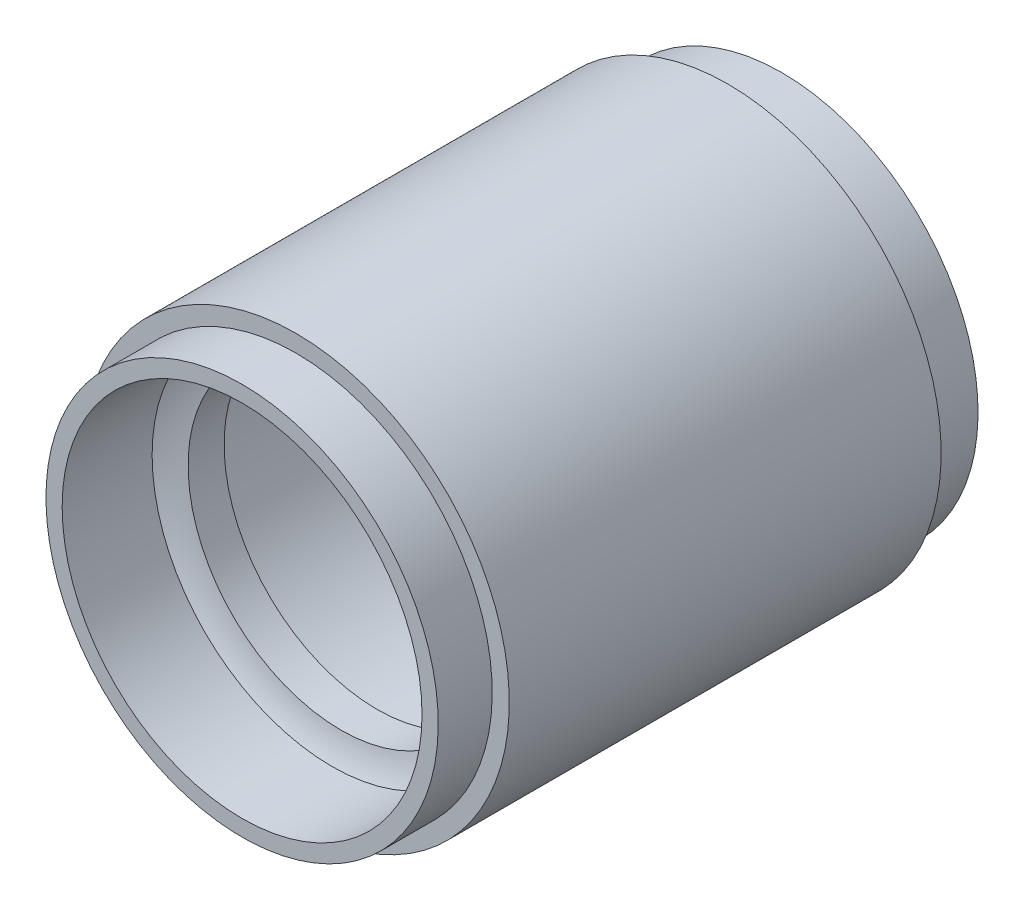
ISO-10303-21;
HEADER;
FILE_DESCRIPTION(('STEP AP214'),'2;1');
FILE_NAME('part.step','',(''),(''),'','','');
FILE_SCHEMA(('AUTOMOTIVE_DESIGN { 1 0 10303 214 1 1 1 1 }'));
ENDSEC;
DATA;
#1=APPLICATION_CONTEXT('core data for automotive mechanical design processes');
#2=APPLICATION_PROTOCOL_DEFINITION('international standard','automotive_design',2000,#1);
#3=PRODUCT_CONTEXT('',#1,'mechanical');
#4=PRODUCT('Part','Part','',(#3));
#5=PRODUCT_RELATED_PRODUCT_CATEGORY('part','',(#4));
#6=PRODUCT_DEFINITION_FORMATION('','',#4);
#7=PRODUCT_DEFINITION_CONTEXT('part definition',#1,'design');
#8=PRODUCT_DEFINITION('design','',#6,#7);
#9=PRODUCT_DEFINITION_SHAPE('','',#8);
#10=(LENGTH_UNIT() NAMED_UNIT(*) SI_UNIT(.MILLI.,.METRE.));
#11=(NAMED_UNIT(*) PLANE_ANGLE_UNIT() SI_UNIT($,.RADIAN.));
#12=(NAMED_UNIT(*) SI_UNIT($,.STERADIAN.) SOLID_ANGLE_UNIT());
#13=UNCERTAINTY_MEASURE_WITH_UNIT(LENGTH_MEASURE(1.E-05),#10,'distance_accuracy_value','');
#14=(GEOMETRIC_REPRESENTATION_CONTEXT(3) GLOBAL_UNCERTAINTY_ASSIGNED_CONTEXT((#13)) GLOBAL_UNIT_ASSIGNED_CONTEXT((#10,
#11,#12)) REPRESENTATION_CONTEXT('',''));
#15=CARTESIAN_POINT('',(0.,0.,0.));
#16=DIRECTION('',(0.,0.,1.));
#17=DIRECTION('',(1.,0.,0.));
#18=AXIS2_PLACEMENT_3D('',#15,#16,#17);
#19=CARTESIAN_POINT('',(0.,0.,0.));
#20=DIRECTION('',(0.,0.,-1.));
#21=DIRECTION('',(0.,1.,0.));
#22=AXIS2_PLACEMENT_3D('',#19,#20,#21);
#23=CYLINDRICAL_SURFACE('',#22,10.);
#24=CARTESIAN_POINT('',(0.,0.,10.));
#25=DIRECTION('',(0.,0.,-1.));
#26=DIRECTION('',(0.,1.,0.));
#27=AXIS2_PLACEMENT_3D('',#24,#25,#26);
#28=CIRCLE('',#27,10.);
#29=CARTESIAN_POINT('',(0.,10.,10.));
#30=VERTEX_POINT('',#29);
#31=EDGE_CURVE('E82',#30,#30,#28,.T.);
#32=ORIENTED_EDGE('',*,*,#31,.T.);
#33=EDGE_LOOP('',(#32));
#34=FACE_BOUND('',#33,.T.);
#35=CARTESIAN_POINT('',(0.,0.,15.));
#36=DIRECTION('',(0.,0.,-1.));
#37=DIRECTION('',(0.,1.,0.));
#38=AXIS2_PLACEMENT_3D('',#35,#36,#37);
#39=CIRCLE('',#38,10.);
#40=CARTESIAN_POINT('',(0.,10.,15.));
#41=VERTEX_POINT('',#40);
#42=EDGE_CURVE('E10',#41,#41,#39,.T.);
#43=ORIENTED_EDGE('',*,*,#42,.F.);
#44=EDGE_LOOP('',(#43));
#45=FACE_BOUND('',#44,.T.);
#46=ADVANCED_FACE('F30',(#34,#45),#23,.F.);
#47=CARTESIAN_POINT('',(0.,10.9,15.));
#48=DIRECTION('',(0.,0.,1.));
#49=DIRECTION('',(0.,-1.,0.));
#50=AXIS2_PLACEMENT_3D('',#47,#48,#49);
#51=PLANE('',#50);
#52=ORIENTED_EDGE('',*,*,#42,.T.);
#53=EDGE_LOOP('',(#52));
#54=FACE_BOUND('',#53,.T.);
#55=CARTESIAN_POINT('',(0.,0.,15.));
#56=DIRECTION('',(0.,0.,-1.));
#57=DIRECTION('',(0.,1.,0.));
#58=AXIS2_PLACEMENT_3D('',#55,#56,#57);
#59=CIRCLE('',#58,10.9);
#60=CARTESIAN_POINT('',(0.,10.9,15.));
#61=VERTEX_POINT('',#60);
#62=EDGE_CURVE('E36',#61,#61,#59,.T.);
#63=ORIENTED_EDGE('',*,*,#62,.F.);
#64=EDGE_LOOP('',(#63));
#65=FACE_BOUND('',#64,.T.);
#66=ADVANCED_FACE('F100',(#54,#65),#51,.T.);
#67=CARTESIAN_POINT('',(0.,0.,0.));
#68=DIRECTION('',(0.,0.,-1.));
#69=DIRECTION('',(0.,1.,0.));
#70=AXIS2_PLACEMENT_3D('',#67,#68,#69);
#71=CYLINDRICAL_SURFACE('',#70,10.9);
#72=ORIENTED_EDGE('',*,*,#62,.T.);
#73=EDGE_LOOP('',(#72));
#74=FACE_BOUND('',#73,.T.);
#75=CARTESIAN_POINT('',(0.,0.,12.));
#76=DIRECTION('',(0.,0.,-1.));
#77=DIRECTION('',(0.,1.,0.));
#78=AXIS2_PLACEMENT_3D('',#75,#76,#77);
#79=CIRCLE('',#78,10.9);
#80=CARTESIAN_POINT('',(0.,10.9,12.));
#81=VERTEX_POINT('',#80);
#82=EDGE_CURVE('E40',#81,#81,#79,.T.);
#83=ORIENTED_EDGE('',*,*,#82,.F.);
#84=EDGE_LOOP('',(#83));
#85=FACE_BOUND('',#84,.T.);
#86=ADVANCED_FACE('F104',(#74,#85),#71,.T.);
#87=CARTESIAN_POINT('',(0.,11.85,12.));
#88=DIRECTION('',(0.,0.,1.));
#89=DIRECTION('',(0.,-1.,0.));
#90=AXIS2_PLACEMENT_3D('',#87,#88,#89);
#91=PLANE('',#90);
#92=ORIENTED_EDGE('',*,*,#82,.T.);
#93=EDGE_LOOP('',(#92));
#94=FACE_BOUND('',#93,.T.);
#95=CARTESIAN_POINT('',(0.,0.,12.));
#96=DIRECTION('',(0.,0.,-1.));
#97=DIRECTION('',(0.,1.,0.));
#98=AXIS2_PLACEMENT_3D('',#95,#96,#97);
#99=CIRCLE('',#98,11.85);
#100=CARTESIAN_POINT('',(0.,11.85,12.));
#101=VERTEX_POINT('',#100);
#102=EDGE_CURVE('E44',#101,#101,#99,.T.);
#103=ORIENTED_EDGE('',*,*,#102,.F.);
#104=EDGE_LOOP('',(#103));
#105=FACE_BOUND('',#104,.T.);
#106=ADVANCED_FACE('F108',(#94,#105),#91,.T.);
#107=CARTESIAN_POINT('',(0.,0.,0.));
#108=DIRECTION('',(0.,0.,-1.));
#109=DIRECTION('',(0.,1.,0.));
#110=AXIS2_PLACEMENT_3D('',#107,#108,#109);
#111=CYLINDRICAL_SURFACE('',#110,11.85);
#112=ORIENTED_EDGE('',*,*,#102,.T.);
#113=EDGE_LOOP('',(#112));
#114=FACE_BOUND('',#113,.T.);
#115=CARTESIAN_POINT('',(0.,0.,-12.));
#116=DIRECTION('',(0.,0.,-1.));
#117=DIRECTION('',(0.,1.,0.));
#118=AXIS2_PLACEMENT_3D('',#115,#116,#117);
#119=CIRCLE('',#118,11.85);
#120=CARTESIAN_POINT('',(0.,11.85,-12.));
#121=VERTEX_POINT('',#120);
#122=EDGE_CURVE('E49',#121,#121,#119,.T.);
#123=ORIENTED_EDGE('',*,*,#122,.F.);
#124=EDGE_LOOP('',(#123));
#125=FACE_BOUND('',#124,.T.);
#126=ADVANCED_FACE('F114',(#114,#125),#111,.T.);
#127=CARTESIAN_POINT('',(0.,11.85,-12.));
#128=DIRECTION('',(0.,0.,-1.));
#129=DIRECTION('',(0.,1.,0.));
#130=AXIS2_PLACEMENT_3D('',#127,#128,#129);
#131=PLANE('',#130);
#132=ORIENTED_EDGE('',*,*,#122,.T.);
#133=EDGE_LOOP('',(#132));
#134=FACE_BOUND('',#133,.T.);
#135=CARTESIAN_POINT('',(0.,0.,-12.));
#136=DIRECTION('',(0.,0.,-1.));
#137=DIRECTION('',(0.,1.,0.));
#138=AXIS2_PLACEMENT_3D('',#135,#136,#137);
#139=CIRCLE('',#138,10.9);
#140=CARTESIAN_POINT('',(0.,10.9,-12.));
#141=VERTEX_POINT('',#140);
#142=EDGE_CURVE('E52',#141,#141,#139,.T.);
#143=ORIENTED_EDGE('',*,*,#142,.F.);
#144=EDGE_LOOP('',(#143));
#145=FACE_BOUND('',#144,.T.);
#146=ADVANCED_FACE('F118',(#134,#145),#131,.T.);
#147=CARTESIAN_POINT('',(0.,0.,0.));
#148=DIRECTION('',(0.,0.,-1.));
#149=DIRECTION('',(0.,1.,0.));
#150=AXIS2_PLACEMENT_3D('',#147,#148,#149);
#151=CYLINDRICAL_SURFACE('',#150,10.9);
#152=ORIENTED_EDGE('',*,*,#142,.T.);
#153=EDGE_LOOP('',(#152));
#154=FACE_BOUND('',#153,.T.);
#155=CARTESIAN_POINT('',(0.,0.,-15.));
#156=DIRECTION('',(0.,0.,-1.));
#157=DIRECTION('',(0.,1.,0.));
#158=AXIS2_PLACEMENT_3D('',#155,#156,#157);
#159=CIRCLE('',#158,10.9);
#160=CARTESIAN_POINT('',(0.,10.9,-15.));
#161=VERTEX_POINT('',#160);
#162=EDGE_CURVE('E55',#161,#161,#159,.T.);
#163=ORIENTED_EDGE('',*,*,#162,.F.);
#164=EDGE_LOOP('',(#163));
#165=FACE_BOUND('',#164,.T.);
#166=ADVANCED_FACE('F122',(#154,#165),#151,.T.);
#167=CARTESIAN_POINT('',(0.,10.9,-15.));
#168=DIRECTION('',(0.,0.,-1.));
#169=DIRECTION('',(0.,1.,0.));
#170=AXIS2_PLACEMENT_3D('',#167,#168,#169);
#171=PLANE('',#170);
#172=ORIENTED_EDGE('',*,*,#162,.T.);
#173=EDGE_LOOP('',(#172));
#174=FACE_BOUND('',#173,.T.);
#175=CARTESIAN_POINT('',(0.,0.,-15.));
#176=DIRECTION('',(0.,0.,-1.));
#177=DIRECTION('',(0.,1.,0.));
#178=AXIS2_PLACEMENT_3D('',#175,#176,#177);
#179=CIRCLE('',#178,10.);
#180=CARTESIAN_POINT('',(0.,10.,-15.));
#181=VERTEX_POINT('',#180);
#182=EDGE_CURVE('E58',#181,#181,#179,.T.);
#183=ORIENTED_EDGE('',*,*,#182,.F.);
#184=EDGE_LOOP('',(#183));
#185=FACE_BOUND('',#184,.T.);
#186=ADVANCED_FACE('F126',(#174,#185),#171,.T.);
#187=CARTESIAN_POINT('',(0.,0.,0.));
#188=DIRECTION('',(0.,0.,-1.));
#189=DIRECTION('',(0.,1.,0.));
#190=AXIS2_PLACEMENT_3D('',#187,#188,#189);
#191=CYLINDRICAL_SURFACE('',#190,10.);
#192=ORIENTED_EDGE('',*,*,#182,.T.);
#193=EDGE_LOOP('',(#192));
#194=FACE_BOUND('',#193,.T.);
#195=CARTESIAN_POINT('',(0.,0.,-10.));
#196=DIRECTION('',(0.,0.,-1.));
#197=DIRECTION('',(0.,1.,0.));
#198=AXIS2_PLACEMENT_3D('',#195,#196,#197);
#199=CIRCLE('',#198,10.);
#200=CARTESIAN_POINT('',(0.,10.,-10.));
#201=VERTEX_POINT('',#200);
#202=EDGE_CURVE('E61',#201,#201,#199,.T.);
#203=ORIENTED_EDGE('',*,*,#202,.F.);
#204=EDGE_LOOP('',(#203));
#205=FACE_BOUND('',#204,.T.);
#206=ADVANCED_FACE('F130',(#194,#205),#191,.F.);
#207=CARTESIAN_POINT('',(0.,0.,-14.2864901378119));
#208=DIRECTION('',(0.,0.,-1.));
#209=DIRECTION('',(0.,1.,0.));
#210=AXIS2_PLACEMENT_3D('',#207,#208,#209);
#211=TOROIDAL_SURFACE('',#210,7.73783662072935,4.8467907790694);
#212=ORIENTED_EDGE('',*,*,#202,.T.);
#213=EDGE_LOOP('',(#212));
#214=FACE_BOUND('',#213,.T.);
#215=CARTESIAN_POINT('',(0.,0.,-9.5));
#216=DIRECTION('',(0.,0.,-1.));
#217=DIRECTION('',(0.,1.,0.));
#218=AXIS2_PLACEMENT_3D('',#215,#216,#217);
#219=CIRCLE('',#218,8.5);
#220=CARTESIAN_POINT('',(0.,8.5,-9.5));
#221=VERTEX_POINT('',#220);
#222=EDGE_CURVE('E64',#221,#221,#219,.T.);
#223=ORIENTED_EDGE('',*,*,#222,.F.);
#224=EDGE_LOOP('',(#223));
#225=FACE_BOUND('',#224,.T.);
#226=ADVANCED_FACE('F134',(#214,#225),#211,.F.);
#227=CARTESIAN_POINT('',(0.,0.,0.));
#228=DIRECTION('',(0.,0.,-1.));
#229=DIRECTION('',(0.,1.,0.));
#230=AXIS2_PLACEMENT_3D('',#227,#228,#229);
#231=CYLINDRICAL_SURFACE('',#230,8.5);
#232=ORIENTED_EDGE('',*,*,#222,.T.);
#233=EDGE_LOOP('',(#232));
#234=FACE_BOUND('',#233,.T.);
#235=CARTESIAN_POINT('',(0.,0.,-7.5));
#236=DIRECTION('',(0.,0.,-1.));
#237=DIRECTION('',(0.,1.,0.));
#238=AXIS2_PLACEMENT_3D('',#235,#236,#237);
#239=CIRCLE('',#238,8.5);
#240=CARTESIAN_POINT('',(0.,8.5,-7.5));
#241=VERTEX_POINT('',#240);
#242=EDGE_CURVE('E67',#241,#241,#239,.T.);
#243=ORIENTED_EDGE('',*,*,#242,.F.);
#244=EDGE_LOOP('',(#243));
#245=FACE_BOUND('',#244,.T.);
#246=ADVANCED_FACE('F138',(#234,#245),#231,.F.);
#247=CARTESIAN_POINT('',(0.,0.,-6.81739934866065));
#248=DIRECTION('',(0.,0.,1.));
#249=DIRECTION('',(0.,-1.,0.));
#250=AXIS2_PLACEMENT_3D('',#247,#248,#249);
#251=CONICAL_SURFACE('',#250,10.732369835606,1.27405073995191);
#252=ORIENTED_EDGE('',*,*,#242,.T.);
#253=EDGE_LOOP('',(#252));
#254=FACE_BOUND('',#253,.T.);
#255=CARTESIAN_POINT('',(0.,0.,-6.81739934866065));
#256=DIRECTION('',(0.,0.,-1.));
#257=DIRECTION('',(0.,1.,0.));
#258=AXIS2_PLACEMENT_3D('',#255,#256,#257);
#259=CIRCLE('',#258,10.732369835606);
#260=CARTESIAN_POINT('',(0.,10.732369835606,-6.81739934866065));
#261=VERTEX_POINT('',#260);
#262=EDGE_CURVE('E70',#261,#261,#259,.T.);
#263=ORIENTED_EDGE('',*,*,#262,.F.);
#264=EDGE_LOOP('',(#263));
#265=FACE_BOUND('',#264,.T.);
#266=ADVANCED_FACE('F142',(#254,#265),#251,.F.);
#267=CARTESIAN_POINT('',(0.,0.,0.));
#268=DIRECTION('',(0.,0.,-1.));
#269=DIRECTION('',(0.,1.,0.));
#270=AXIS2_PLACEMENT_3D('',#267,#268,#269);
#271=CYLINDRICAL_SURFACE('',#270,10.732369835606);
#272=ORIENTED_EDGE('',*,*,#262,.T.);
#273=EDGE_LOOP('',(#272));
#274=FACE_BOUND('',#273,.T.);
#275=CARTESIAN_POINT('',(0.,0.,6.81739934866065));
#276=DIRECTION('',(0.,0.,-1.));
#277=DIRECTION('',(0.,1.,0.));
#278=AXIS2_PLACEMENT_3D('',#275,#276,#277);
#279=CIRCLE('',#278,10.732369835606);
#280=CARTESIAN_POINT('',(0.,10.732369835606,6.81739934866065));
#281=VERTEX_POINT('',#280);
#282=EDGE_CURVE('E73',#281,#281,#279,.T.);
#283=ORIENTED_EDGE('',*,*,#282,.F.);
#284=EDGE_LOOP('',(#283));
#285=FACE_BOUND('',#284,.T.);
#286=ADVANCED_FACE('F146',(#274,#285),#271,.F.);
#287=CARTESIAN_POINT('',(0.,0.,7.5));
#288=DIRECTION('',(0.,0.,-1.));
#289=DIRECTION('',(0.,1.,0.));
#290=AXIS2_PLACEMENT_3D('',#287,#288,#289);
#291=CONICAL_SURFACE('',#290,8.5,1.27405073995191);
#292=ORIENTED_EDGE('',*,*,#282,.T.);
#293=EDGE_LOOP('',(#292));
#294=FACE_BOUND('',#293,.T.);
#295=CARTESIAN_POINT('',(0.,0.,7.5));
#296=DIRECTION('',(0.,0.,-1.));
#297=DIRECTION('',(0.,1.,0.));
#298=AXIS2_PLACEMENT_3D('',#295,#296,#297);
#299=CIRCLE('',#298,8.5);
#300=CARTESIAN_POINT('',(0.,8.5,7.5));
#301=VERTEX_POINT('',#300);
#302=EDGE_CURVE('E76',#301,#301,#299,.T.);
#303=ORIENTED_EDGE('',*,*,#302,.F.);
#304=EDGE_LOOP('',(#303));
#305=FACE_BOUND('',#304,.T.);
#306=ADVANCED_FACE('F96',(#294,#305),#291,.F.);
#307=CARTESIAN_POINT('',(0.,0.,0.));
#308=DIRECTION('',(0.,0.,-1.));
#309=DIRECTION('',(0.,1.,0.));
#310=AXIS2_PLACEMENT_3D('',#307,#308,#309);
#311=CYLINDRICAL_SURFACE('',#310,8.5);
#312=ORIENTED_EDGE('',*,*,#302,.T.);
#313=EDGE_LOOP('',(#312));
#314=FACE_BOUND('',#313,.T.);
#315=CARTESIAN_POINT('',(0.,0.,9.5));
#316=DIRECTION('',(0.,0.,-1.));
#317=DIRECTION('',(0.,1.,0.));
#318=AXIS2_PLACEMENT_3D('',#315,#316,#317);
#319=CIRCLE('',#318,8.5);
#320=CARTESIAN_POINT('',(0.,8.5,9.5));
#321=VERTEX_POINT('',#320);
#322=EDGE_CURVE('E79',#321,#321,#319,.T.);
#323=ORIENTED_EDGE('',*,*,#322,.F.);
#324=EDGE_LOOP('',(#323));
#325=FACE_BOUND('',#324,.T.);
#326=ADVANCED_FACE('F90',(#314,#325),#311,.F.);
#327=CARTESIAN_POINT('',(0.,0.,14.2864901378119));
#328=DIRECTION('',(0.,0.,-1.));
#329=DIRECTION('',(0.,1.,0.));
#330=AXIS2_PLACEMENT_3D('',#327,#328,#329);
#331=TOROIDAL_SURFACE('',#330,7.73783662072936,4.8467907790694);
#332=ORIENTED_EDGE('',*,*,#322,.T.);
#333=EDGE_LOOP('',(#332));
#334=FACE_BOUND('',#333,.T.);
#335=ORIENTED_EDGE('',*,*,#31,.F.);
#336=EDGE_LOOP('',(#335));
#337=FACE_BOUND('',#336,.T.);
#338=ADVANCED_FACE('F88',(#334,#337),#331,.F.);
#339=CLOSED_SHELL('',(#46,#66,#86,#106,#126,#146,#166,#186,#206,#226,#246,#266,#286,#306,#326,#338));
#340=MANIFOLD_SOLID_BREP('B2',#339);
#341=ADVANCED_BREP_SHAPE_REPRESENTATION('',(#18,#340),#14);
#342=SHAPE_DEFINITION_REPRESENTATION(#9,#341);
ENDSEC;
END-ISO-10303-21;
